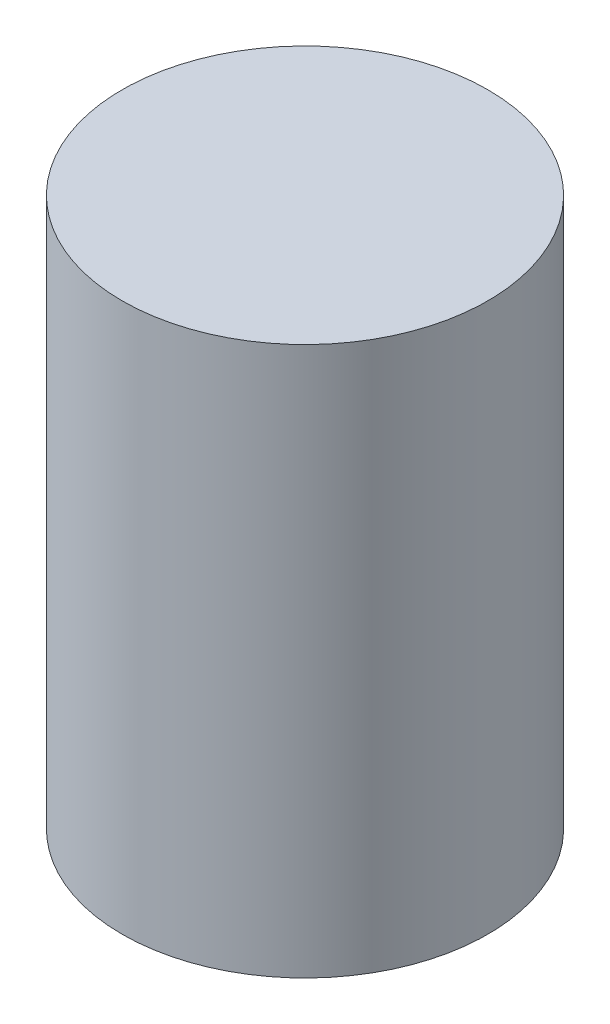
ISO-10303-21;
HEADER;
FILE_DESCRIPTION(('STEP AP214'),'2;1');
FILE_NAME('part.step','',(''),(''),'','','');
FILE_SCHEMA(('AUTOMOTIVE_DESIGN { 1 0 10303 214 1 1 1 1 }'));
ENDSEC;
DATA;
#1=APPLICATION_CONTEXT('core data for automotive mechanical design processes');
#2=APPLICATION_PROTOCOL_DEFINITION('international standard','automotive_design',2000,#1);
#3=PRODUCT_CONTEXT('',#1,'mechanical');
#4=PRODUCT('Part','Part','',(#3));
#5=PRODUCT_RELATED_PRODUCT_CATEGORY('part','',(#4));
#6=PRODUCT_DEFINITION_FORMATION('','',#4);
#7=PRODUCT_DEFINITION_CONTEXT('part definition',#1,'design');
#8=PRODUCT_DEFINITION('design','',#6,#7);
#9=PRODUCT_DEFINITION_SHAPE('','',#8);
#10=(LENGTH_UNIT() NAMED_UNIT(*) SI_UNIT(.MILLI.,.METRE.));
#11=(NAMED_UNIT(*) PLANE_ANGLE_UNIT() SI_UNIT($,.RADIAN.));
#12=(NAMED_UNIT(*) SI_UNIT($,.STERADIAN.) SOLID_ANGLE_UNIT());
#13=UNCERTAINTY_MEASURE_WITH_UNIT(LENGTH_MEASURE(1.E-05),#10,'distance_accuracy_value','');
#14=(GEOMETRIC_REPRESENTATION_CONTEXT(3) GLOBAL_UNCERTAINTY_ASSIGNED_CONTEXT((#13)) GLOBAL_UNIT_ASSIGNED_CONTEXT((#10,
#11,#12)) REPRESENTATION_CONTEXT('',''));
#15=CARTESIAN_POINT('',(0.,0.,0.));
#16=DIRECTION('',(0.,0.,1.));
#17=DIRECTION('',(1.,0.,0.));
#18=AXIS2_PLACEMENT_3D('',#15,#16,#17);
#19=CARTESIAN_POINT('',(0.,9.525,0.));
#20=DIRECTION('',(0.,-1.,0.));
#21=DIRECTION('',(0.,0.,-1.));
#22=AXIS2_PLACEMENT_3D('',#19,#20,#21);
#23=CYLINDRICAL_SURFACE('',#22,3.175);
#24=CARTESIAN_POINT('',(0.,9.525,0.));
#25=DIRECTION('',(0.,1.,0.));
#26=DIRECTION('',(0.,0.,1.));
#27=AXIS2_PLACEMENT_3D('',#24,#25,#26);
#28=CIRCLE('',#27,3.175);
#29=CARTESIAN_POINT('',(0.,9.525,-3.175));
#30=VERTEX_POINT('',#29);
#31=EDGE_CURVE('E10',#30,#30,#28,.T.);
#32=CARTESIAN_POINT('',(0.,0.,0.));
#33=DIRECTION('',(0.,1.,0.));
#34=DIRECTION('',(0.,0.,1.));
#35=AXIS2_PLACEMENT_3D('',#32,#33,#34);
#36=CIRCLE('',#35,3.175);
#37=CARTESIAN_POINT('',(0.,0.,-3.175));
#38=VERTEX_POINT('',#37);
#39=EDGE_CURVE('E34',#38,#38,#36,.T.);
#40=CARTESIAN_POINT('',(0.,9.525,-3.175));
#41=CARTESIAN_POINT('',(0.,9.42578125,-3.175));
#42=CARTESIAN_POINT('',(0.,9.3265625,-3.175));
#43=CARTESIAN_POINT('',(0.,9.128125,-3.175));
#44=CARTESIAN_POINT('',(0.,9.02890625,-3.175));
#45=CARTESIAN_POINT('',(0.,8.83046875,-3.175));
#46=CARTESIAN_POINT('',(0.,8.73125,-3.175));
#47=CARTESIAN_POINT('',(0.,8.5328125,-3.175));
#48=CARTESIAN_POINT('',(0.,8.43359375,-3.175));
#49=CARTESIAN_POINT('',(0.,8.23515625,-3.175));
#50=CARTESIAN_POINT('',(0.,8.1359375,-3.175));
#51=CARTESIAN_POINT('',(0.,7.9375,-3.175));
#52=CARTESIAN_POINT('',(0.,7.83828125,-3.175));
#53=CARTESIAN_POINT('',(0.,7.63984375,-3.175));
#54=CARTESIAN_POINT('',(0.,7.540625,-3.175));
#55=CARTESIAN_POINT('',(0.,7.3421875,-3.175));
#56=CARTESIAN_POINT('',(0.,7.24296875,-3.175));
#57=CARTESIAN_POINT('',(0.,7.04453125,-3.175));
#58=CARTESIAN_POINT('',(0.,6.9453125,-3.175));
#59=CARTESIAN_POINT('',(0.,6.746875,-3.175));
#60=CARTESIAN_POINT('',(0.,6.64765625,-3.175));
#61=CARTESIAN_POINT('',(0.,6.44921875,-3.175));
#62=CARTESIAN_POINT('',(0.,6.35,-3.175));
#63=CARTESIAN_POINT('',(0.,6.1515625,-3.175));
#64=CARTESIAN_POINT('',(0.,6.05234375,-3.175));
#65=CARTESIAN_POINT('',(0.,5.85390625,-3.175));
#66=CARTESIAN_POINT('',(0.,5.7546875,-3.175));
#67=CARTESIAN_POINT('',(0.,5.55625,-3.175));
#68=CARTESIAN_POINT('',(0.,5.45703125,-3.175));
#69=CARTESIAN_POINT('',(0.,5.25859375,-3.175));
#70=CARTESIAN_POINT('',(0.,5.159375,-3.175));
#71=CARTESIAN_POINT('',(0.,4.9609375,-3.175));
#72=CARTESIAN_POINT('',(0.,4.86171875,-3.175));
#73=CARTESIAN_POINT('',(0.,4.66328125,-3.175));
#74=CARTESIAN_POINT('',(0.,4.5640625,-3.175));
#75=CARTESIAN_POINT('',(0.,4.365625,-3.175));
#76=CARTESIAN_POINT('',(0.,4.26640625,-3.175));
#77=CARTESIAN_POINT('',(0.,4.06796875,-3.175));
#78=CARTESIAN_POINT('',(0.,3.96875,-3.175));
#79=CARTESIAN_POINT('',(0.,3.7703125,-3.175));
#80=CARTESIAN_POINT('',(0.,3.67109375,-3.175));
#81=CARTESIAN_POINT('',(0.,3.47265625,-3.175));
#82=CARTESIAN_POINT('',(0.,3.3734375,-3.175));
#83=CARTESIAN_POINT('',(0.,3.175,-3.175));
#84=CARTESIAN_POINT('',(0.,3.07578125,-3.175));
#85=CARTESIAN_POINT('',(0.,2.87734375,-3.175));
#86=CARTESIAN_POINT('',(0.,2.778125,-3.175));
#87=CARTESIAN_POINT('',(0.,2.5796875,-3.175));
#88=CARTESIAN_POINT('',(0.,2.48046875,-3.175));
#89=CARTESIAN_POINT('',(0.,2.28203125,-3.175));
#90=CARTESIAN_POINT('',(0.,2.1828125,-3.175));
#91=CARTESIAN_POINT('',(0.,1.984375,-3.175));
#92=CARTESIAN_POINT('',(0.,1.88515625,-3.175));
#93=CARTESIAN_POINT('',(0.,1.68671875,-3.175));
#94=CARTESIAN_POINT('',(0.,1.5875,-3.175));
#95=CARTESIAN_POINT('',(0.,1.3890625,-3.175));
#96=CARTESIAN_POINT('',(0.,1.28984375,-3.175));
#97=CARTESIAN_POINT('',(0.,1.09140625,-3.175));
#98=CARTESIAN_POINT('',(0.,0.992187500000001,-3.175));
#99=CARTESIAN_POINT('',(0.,0.793750000000001,-3.175));
#100=CARTESIAN_POINT('',(0.,0.69453125,-3.175));
#101=CARTESIAN_POINT('',(0.,0.49609375,-3.175));
#102=CARTESIAN_POINT('',(0.,0.396875,-3.175));
#103=CARTESIAN_POINT('',(0.,0.1984375,-3.175));
#104=CARTESIAN_POINT('',(0.,0.0992187500000001,-3.175));
#105=CARTESIAN_POINT('',(0.,0.,-3.175));
#106=B_SPLINE_CURVE_WITH_KNOTS('',3,(#40,#41,#42,#43,#44,#45,#46,#47,#48,#49,#50,#51,#52,#53,
#54,#55,#56,#57,#58,#59,#60,#61,#62,#63,#64,#65,#66,#67,#68,#69,#70,#71,#72,#73,#74,#75,#76,#77,
#78,#79,#80,#81,#82,#83,#84,#85,#86,#87,#88,#89,#90,#91,#92,#93,#94,#95,#96,#97,#98,#99,#100,
#101,#102,#103,#104,#105),.UNSPECIFIED.,.F.,.F.,(4,2,2,2,2,2,2,2,2,2,2,2,2,2,2,2,2,2,2,2,2,2,2,
2,2,2,2,2,2,2,2,2,4),(0.,0.29765625,0.5953125,0.892968750000001,1.190625,1.48828125,1.7859375,
2.08359375,2.38125,2.67890625,2.9765625,3.27421875,3.571875,3.86953125,4.1671875,4.46484375,
4.7625,5.06015625,5.3578125,5.65546875,5.953125,6.25078125,6.5484375,6.84609375,7.14375,
7.44140625,7.7390625,8.03671875,8.334375,8.63203125,8.9296875,9.22734375,9.525),.UNSPECIFIED.);
#107=EDGE_CURVE('BSEAM31',#30,#38,#106,.T.);
#108=ORIENTED_EDGE('',*,*,#31,.F.);
#109=ORIENTED_EDGE('',*,*,#39,.T.);
#110=ORIENTED_EDGE('',*,*,#107,.T.);
#111=ORIENTED_EDGE('',*,*,#107,.F.);
#112=EDGE_LOOP('',(#108,#110,#109,#111));
#113=FACE_BOUND('',#112,.T.);
#114=ADVANCED_FACE('F31',(#113),#23,.T.);
#115=CARTESIAN_POINT('',(0.,9.525,0.));
#116=DIRECTION('',(0.,1.,0.));
#117=DIRECTION('',(0.,0.,1.));
#118=AXIS2_PLACEMENT_3D('',#115,#116,#117);
#119=PLANE('',#118);
#120=ORIENTED_EDGE('',*,*,#31,.T.);
#121=EDGE_LOOP('',(#120));
#122=FACE_BOUND('',#121,.T.);
#123=ADVANCED_FACE('F46',(#122),#119,.T.);
#124=CARTESIAN_POINT('',(0.,0.,0.));
#125=DIRECTION('',(0.,1.,0.));
#126=DIRECTION('',(0.,0.,1.));
#127=AXIS2_PLACEMENT_3D('',#124,#125,#126);
#128=PLANE('',#127);
#129=ORIENTED_EDGE('',*,*,#39,.F.);
#130=EDGE_LOOP('',(#129));
#131=FACE_BOUND('',#130,.T.);
#132=ADVANCED_FACE('F44',(#131),#128,.F.);
#133=CLOSED_SHELL('',(#114,#123,#132));
#134=MANIFOLD_SOLID_BREP('B2',#133);
#135=ADVANCED_BREP_SHAPE_REPRESENTATION('',(#18,#134),#14);
#136=SHAPE_DEFINITION_REPRESENTATION(#9,#135);
ENDSEC;
END-ISO-10303-21;
